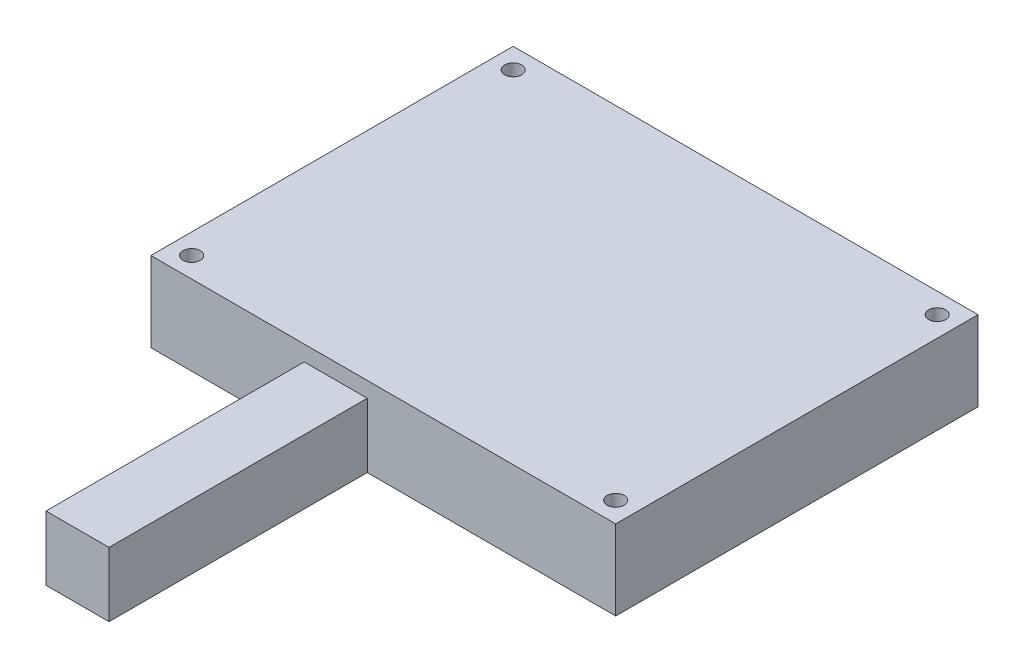
ISO-10303-21;
HEADER;
FILE_DESCRIPTION(('STEP AP214'),'2;1');
FILE_NAME('part.step','',(''),(''),'','','');
FILE_SCHEMA(('AUTOMOTIVE_DESIGN { 1 0 10303 214 1 1 1 1 }'));
ENDSEC;
DATA;
#1=APPLICATION_CONTEXT('core data for automotive mechanical design processes');
#2=APPLICATION_PROTOCOL_DEFINITION('international standard','automotive_design',2000,#1);
#3=PRODUCT_CONTEXT('',#1,'mechanical');
#4=PRODUCT('Part','Part','',(#3));
#5=PRODUCT_RELATED_PRODUCT_CATEGORY('part','',(#4));
#6=PRODUCT_DEFINITION_FORMATION('','',#4);
#7=PRODUCT_DEFINITION_CONTEXT('part definition',#1,'design');
#8=PRODUCT_DEFINITION('design','',#6,#7);
#9=PRODUCT_DEFINITION_SHAPE('','',#8);
#10=(LENGTH_UNIT() NAMED_UNIT(*) SI_UNIT(.MILLI.,.METRE.));
#11=(NAMED_UNIT(*) PLANE_ANGLE_UNIT() SI_UNIT($,.RADIAN.));
#12=(NAMED_UNIT(*) SI_UNIT($,.STERADIAN.) SOLID_ANGLE_UNIT());
#13=UNCERTAINTY_MEASURE_WITH_UNIT(LENGTH_MEASURE(1.E-05),#10,'distance_accuracy_value','');
#14=(GEOMETRIC_REPRESENTATION_CONTEXT(3) GLOBAL_UNCERTAINTY_ASSIGNED_CONTEXT((#13)) GLOBAL_UNIT_ASSIGNED_CONTEXT((#10,
#11,#12)) REPRESENTATION_CONTEXT('',''));
#15=CARTESIAN_POINT('',(0.,0.,0.));
#16=DIRECTION('',(0.,0.,1.));
#17=DIRECTION('',(1.,0.,0.));
#18=AXIS2_PLACEMENT_3D('',#15,#16,#17);
#19=CARTESIAN_POINT('',(-45.,15.45,35.075));
#20=DIRECTION('',(0.,0.,-1.));
#21=DIRECTION('',(-1.,0.,0.));
#22=AXIS2_PLACEMENT_3D('',#19,#20,#21);
#23=PLANE('',#22);
#24=DIRECTION('',(0.,-1.,0.));
#25=VECTOR('',#24,1.);
#26=CARTESIAN_POINT('',(-15.3,0.,35.075));
#27=LINE('',#26,#25);
#28=CARTESIAN_POINT('',(-15.3,12.46,35.075));
#29=VERTEX_POINT('',#28);
#30=CARTESIAN_POINT('',(-15.3,0.,35.075));
#31=VERTEX_POINT('',#30);
#32=EDGE_CURVE('E47',#29,#31,#27,.T.);
#33=ORIENTED_EDGE('',*,*,#32,.F.);
#34=DIRECTION('',(-1.,0.,0.));
#35=VECTOR('',#34,1.);
#36=CARTESIAN_POINT('',(-15.3,12.46,35.075));
#37=LINE('',#36,#35);
#38=CARTESIAN_POINT('',(-3.1,12.46,35.075));
#39=VERTEX_POINT('',#38);
#40=EDGE_CURVE('E118',#39,#29,#37,.T.);
#41=ORIENTED_EDGE('',*,*,#40,.F.);
#42=DIRECTION('',(0.,1.,0.));
#43=VECTOR('',#42,1.);
#44=CARTESIAN_POINT('',(-3.1,0.,35.075));
#45=LINE('',#44,#43);
#46=CARTESIAN_POINT('',(-3.10000000000001,0.,35.075));
#47=VERTEX_POINT('',#46);
#48=EDGE_CURVE('E53',#47,#39,#45,.T.);
#49=ORIENTED_EDGE('',*,*,#48,.F.);
#50=DIRECTION('',(1.,0.,0.));
#51=VECTOR('',#50,1.);
#52=CARTESIAN_POINT('',(-45.,0.,35.075));
#53=LINE('',#52,#51);
#54=CARTESIAN_POINT('',(45.,0.,35.075));
#55=VERTEX_POINT('',#54);
#56=EDGE_CURVE('E168',#47,#55,#53,.T.);
#57=ORIENTED_EDGE('',*,*,#56,.T.);
#58=DIRECTION('',(0.,-1.,0.));
#59=VECTOR('',#58,1.);
#60=CARTESIAN_POINT('',(45.,15.45,35.075));
#61=LINE('',#60,#59);
#62=CARTESIAN_POINT('',(45.,15.45,35.075));
#63=VERTEX_POINT('',#62);
#64=EDGE_CURVE('E161',#63,#55,#61,.T.);
#65=ORIENTED_EDGE('',*,*,#64,.F.);
#66=DIRECTION('',(1.,0.,0.));
#67=VECTOR('',#66,1.);
#68=CARTESIAN_POINT('',(-45.,15.45,35.075));
#69=LINE('',#68,#67);
#70=CARTESIAN_POINT('',(-45.,15.45,35.075));
#71=VERTEX_POINT('',#70);
#72=EDGE_CURVE('E159',#71,#63,#69,.T.);
#73=ORIENTED_EDGE('',*,*,#72,.F.);
#74=DIRECTION('',(0.,-1.,0.));
#75=VECTOR('',#74,1.);
#76=CARTESIAN_POINT('',(-45.,15.45,35.075));
#77=LINE('',#76,#75);
#78=CARTESIAN_POINT('',(-45.,0.,35.075));
#79=VERTEX_POINT('',#78);
#80=EDGE_CURVE('E172',#71,#79,#77,.T.);
#81=ORIENTED_EDGE('',*,*,#80,.T.);
#82=EDGE_CURVE('E155',#79,#31,#53,.T.);
#83=ORIENTED_EDGE('',*,*,#82,.T.);
#84=EDGE_LOOP('',(#33,#41,#49,#57,#65,#73,#81,#83));
#85=FACE_BOUND('',#84,.T.);
#86=ADVANCED_FACE('F32',(#85),#23,.F.);
#87=CARTESIAN_POINT('',(0.,15.45,0.));
#88=DIRECTION('',(0.,-1.,0.));
#89=DIRECTION('',(0.,0.,-1.));
#90=AXIS2_PLACEMENT_3D('',#87,#88,#89);
#91=PLANE('',#90);
#92=DIRECTION('',(0.,0.,-1.));
#93=VECTOR('',#92,1.);
#94=CARTESIAN_POINT('',(45.,15.45,35.075));
#95=LINE('',#94,#93);
#96=CARTESIAN_POINT('',(45.,15.45,-35.075));
#97=VERTEX_POINT('',#96);
#98=EDGE_CURVE('E151',#63,#97,#95,.T.);
#99=ORIENTED_EDGE('',*,*,#98,.T.);
#100=DIRECTION('',(-1.,0.,0.));
#101=VECTOR('',#100,1.);
#102=CARTESIAN_POINT('',(-45.,15.45,-35.075));
#103=LINE('',#102,#101);
#104=CARTESIAN_POINT('',(-45.,15.45,-35.075));
#105=VERTEX_POINT('',#104);
#106=EDGE_CURVE('E154',#97,#105,#103,.T.);
#107=ORIENTED_EDGE('',*,*,#106,.T.);
#108=DIRECTION('',(0.,0.,1.));
#109=VECTOR('',#108,1.);
#110=CARTESIAN_POINT('',(-45.,15.45,35.075));
#111=LINE('',#110,#109);
#112=EDGE_CURVE('E157',#105,#71,#111,.T.);
#113=ORIENTED_EDGE('',*,*,#112,.T.);
#114=ORIENTED_EDGE('',*,*,#72,.T.);
#115=EDGE_LOOP('',(#99,#107,#113,#114));
#116=FACE_BOUND('',#115,.T.);
#117=CARTESIAN_POINT('',(-41.05,15.45,-31.125));
#118=DIRECTION('',(0.,1.,0.));
#119=DIRECTION('',(0.,0.,1.));
#120=AXIS2_PLACEMENT_3D('',#117,#118,#119);
#121=CIRCLE('',#120,1.65);
#122=CARTESIAN_POINT('',(-41.05,15.45,-29.475));
#123=VERTEX_POINT('',#122);
#124=EDGE_CURVE('E145',#123,#123,#121,.T.);
#125=ORIENTED_EDGE('',*,*,#124,.F.);
#126=EDGE_LOOP('',(#125));
#127=FACE_BOUND('',#126,.T.);
#128=CARTESIAN_POINT('',(41.05,15.45,-31.125));
#129=DIRECTION('',(0.,1.,0.));
#130=DIRECTION('',(0.,0.,1.));
#131=AXIS2_PLACEMENT_3D('',#128,#129,#130);
#132=CIRCLE('',#131,1.65);
#133=CARTESIAN_POINT('',(41.05,15.45,-29.475));
#134=VERTEX_POINT('',#133);
#135=EDGE_CURVE('E139',#134,#134,#132,.T.);
#136=ORIENTED_EDGE('',*,*,#135,.F.);
#137=EDGE_LOOP('',(#136));
#138=FACE_BOUND('',#137,.T.);
#139=CARTESIAN_POINT('',(41.05,15.45,31.125));
#140=DIRECTION('',(0.,1.,0.));
#141=DIRECTION('',(0.,0.,1.));
#142=AXIS2_PLACEMENT_3D('',#139,#140,#141);
#143=CIRCLE('',#142,1.65);
#144=CARTESIAN_POINT('',(41.05,15.45,32.775));
#145=VERTEX_POINT('',#144);
#146=EDGE_CURVE('E133',#145,#145,#143,.T.);
#147=ORIENTED_EDGE('',*,*,#146,.F.);
#148=EDGE_LOOP('',(#147));
#149=FACE_BOUND('',#148,.T.);
#150=CARTESIAN_POINT('',(-41.05,15.45,31.125));
#151=DIRECTION('',(0.,1.,0.));
#152=DIRECTION('',(0.,0.,1.));
#153=AXIS2_PLACEMENT_3D('',#150,#151,#152);
#154=CIRCLE('',#153,1.65);
#155=CARTESIAN_POINT('',(-41.05,15.45,32.775));
#156=VERTEX_POINT('',#155);
#157=EDGE_CURVE('E124',#156,#156,#154,.T.);
#158=ORIENTED_EDGE('',*,*,#157,.F.);
#159=EDGE_LOOP('',(#158));
#160=FACE_BOUND('',#159,.T.);
#161=ADVANCED_FACE('F186',(#116,#127,#138,#149,#160),#91,.F.);
#162=CARTESIAN_POINT('',(0.,0.,0.));
#163=DIRECTION('',(0.,-1.,0.));
#164=DIRECTION('',(0.,0.,-1.));
#165=AXIS2_PLACEMENT_3D('',#162,#163,#164);
#166=PLANE('',#165);
#167=CARTESIAN_POINT('',(41.05,0.,31.125));
#168=DIRECTION('',(0.,1.,0.));
#169=DIRECTION('',(0.,0.,1.));
#170=AXIS2_PLACEMENT_3D('',#167,#168,#169);
#171=CIRCLE('',#170,1.65);
#172=CARTESIAN_POINT('',(41.05,0.,32.775));
#173=VERTEX_POINT('',#172);
#174=EDGE_CURVE('E131',#173,#173,#171,.T.);
#175=ORIENTED_EDGE('',*,*,#174,.T.);
#176=EDGE_LOOP('',(#175));
#177=FACE_BOUND('',#176,.T.);
#178=CARTESIAN_POINT('',(-41.05,0.,-31.125));
#179=DIRECTION('',(0.,1.,0.));
#180=DIRECTION('',(0.,0.,1.));
#181=AXIS2_PLACEMENT_3D('',#178,#179,#180);
#182=CIRCLE('',#181,1.65);
#183=CARTESIAN_POINT('',(-41.05,0.,-29.475));
#184=VERTEX_POINT('',#183);
#185=EDGE_CURVE('E142',#184,#184,#182,.T.);
#186=ORIENTED_EDGE('',*,*,#185,.T.);
#187=EDGE_LOOP('',(#186));
#188=FACE_BOUND('',#187,.T.);
#189=DIRECTION('',(0.,0.,-1.));
#190=VECTOR('',#189,1.);
#191=CARTESIAN_POINT('',(45.,0.,35.075));
#192=LINE('',#191,#190);
#193=CARTESIAN_POINT('',(45.,0.,-35.075));
#194=VERTEX_POINT('',#193);
#195=EDGE_CURVE('E148',#55,#194,#192,.T.);
#196=ORIENTED_EDGE('',*,*,#195,.F.);
#197=ORIENTED_EDGE('',*,*,#56,.F.);
#198=DIRECTION('',(0.,0.,-1.));
#199=VECTOR('',#198,1.);
#200=CARTESIAN_POINT('',(-3.1,0.,85.075));
#201=LINE('',#200,#199);
#202=CARTESIAN_POINT('',(-3.1,0.,85.075));
#203=VERTEX_POINT('',#202);
#204=EDGE_CURVE('E105',#203,#47,#201,.T.);
#205=ORIENTED_EDGE('',*,*,#204,.F.);
#206=DIRECTION('',(1.,0.,0.));
#207=VECTOR('',#206,1.);
#208=CARTESIAN_POINT('',(-15.3,0.,85.075));
#209=LINE('',#208,#207);
#210=CARTESIAN_POINT('',(-15.3,0.,85.075));
#211=VERTEX_POINT('',#210);
#212=EDGE_CURVE('E96',#211,#203,#209,.T.);
#213=ORIENTED_EDGE('',*,*,#212,.F.);
#214=DIRECTION('',(0.,0.,-1.));
#215=VECTOR('',#214,1.);
#216=CARTESIAN_POINT('',(-15.3,0.,85.075));
#217=LINE('',#216,#215);
#218=EDGE_CURVE('E103',#211,#31,#217,.T.);
#219=ORIENTED_EDGE('',*,*,#218,.T.);
#220=ORIENTED_EDGE('',*,*,#82,.F.);
#221=DIRECTION('',(0.,0.,1.));
#222=VECTOR('',#221,1.);
#223=CARTESIAN_POINT('',(-45.,0.,35.075));
#224=LINE('',#223,#222);
#225=CARTESIAN_POINT('',(-45.,0.,-35.075));
#226=VERTEX_POINT('',#225);
#227=EDGE_CURVE('E166',#226,#79,#224,.T.);
#228=ORIENTED_EDGE('',*,*,#227,.F.);
#229=DIRECTION('',(-1.,0.,0.));
#230=VECTOR('',#229,1.);
#231=CARTESIAN_POINT('',(-45.,0.,-35.075));
#232=LINE('',#231,#230);
#233=EDGE_CURVE('E164',#194,#226,#232,.T.);
#234=ORIENTED_EDGE('',*,*,#233,.F.);
#235=EDGE_LOOP('',(#196,#197,#205,#213,#219,#220,#228,#234));
#236=FACE_BOUND('',#235,.T.);
#237=CARTESIAN_POINT('',(41.05,0.,-31.125));
#238=DIRECTION('',(0.,1.,0.));
#239=DIRECTION('',(0.,0.,1.));
#240=AXIS2_PLACEMENT_3D('',#237,#238,#239);
#241=CIRCLE('',#240,1.65);
#242=CARTESIAN_POINT('',(41.05,0.,-29.475));
#243=VERTEX_POINT('',#242);
#244=EDGE_CURVE('E136',#243,#243,#241,.T.);
#245=ORIENTED_EDGE('',*,*,#244,.T.);
#246=EDGE_LOOP('',(#245));
#247=FACE_BOUND('',#246,.T.);
#248=CARTESIAN_POINT('',(-41.05,0.,31.125));
#249=DIRECTION('',(0.,1.,0.));
#250=DIRECTION('',(0.,0.,1.));
#251=AXIS2_PLACEMENT_3D('',#248,#249,#250);
#252=CIRCLE('',#251,1.65);
#253=CARTESIAN_POINT('',(-41.05,0.,32.775));
#254=VERTEX_POINT('',#253);
#255=EDGE_CURVE('E121',#254,#254,#252,.T.);
#256=ORIENTED_EDGE('',*,*,#255,.T.);
#257=EDGE_LOOP('',(#256));
#258=FACE_BOUND('',#257,.T.);
#259=ADVANCED_FACE('F99',(#177,#188,#236,#247,#258),#166,.T.);
#260=CARTESIAN_POINT('',(45.,15.45,35.075));
#261=DIRECTION('',(-1.,0.,0.));
#262=DIRECTION('',(0.,0.,1.));
#263=AXIS2_PLACEMENT_3D('',#260,#261,#262);
#264=PLANE('',#263);
#265=ORIENTED_EDGE('',*,*,#195,.T.);
#266=DIRECTION('',(0.,-1.,0.));
#267=VECTOR('',#266,1.);
#268=CARTESIAN_POINT('',(45.,15.45,-35.075));
#269=LINE('',#268,#267);
#270=EDGE_CURVE('E11',#97,#194,#269,.T.);
#271=ORIENTED_EDGE('',*,*,#270,.F.);
#272=ORIENTED_EDGE('',*,*,#98,.F.);
#273=ORIENTED_EDGE('',*,*,#64,.T.);
#274=EDGE_LOOP('',(#265,#271,#272,#273));
#275=FACE_BOUND('',#274,.T.);
#276=ADVANCED_FACE('F34',(#275),#264,.F.);
#277=CARTESIAN_POINT('',(-45.,15.45,-35.075));
#278=DIRECTION('',(0.,0.,1.));
#279=DIRECTION('',(1.,0.,0.));
#280=AXIS2_PLACEMENT_3D('',#277,#278,#279);
#281=PLANE('',#280);
#282=ORIENTED_EDGE('',*,*,#233,.T.);
#283=DIRECTION('',(0.,-1.,0.));
#284=VECTOR('',#283,1.);
#285=CARTESIAN_POINT('',(-45.,15.45,-35.075));
#286=LINE('',#285,#284);
#287=EDGE_CURVE('E40',#105,#226,#286,.T.);
#288=ORIENTED_EDGE('',*,*,#287,.F.);
#289=ORIENTED_EDGE('',*,*,#106,.F.);
#290=ORIENTED_EDGE('',*,*,#270,.T.);
#291=EDGE_LOOP('',(#282,#288,#289,#290));
#292=FACE_BOUND('',#291,.T.);
#293=ADVANCED_FACE('F189',(#292),#281,.F.);
#294=CARTESIAN_POINT('',(-45.,15.45,35.075));
#295=DIRECTION('',(1.,0.,0.));
#296=DIRECTION('',(0.,0.,-1.));
#297=AXIS2_PLACEMENT_3D('',#294,#295,#296);
#298=PLANE('',#297);
#299=ORIENTED_EDGE('',*,*,#227,.T.);
#300=ORIENTED_EDGE('',*,*,#80,.F.);
#301=ORIENTED_EDGE('',*,*,#112,.F.);
#302=ORIENTED_EDGE('',*,*,#287,.T.);
#303=EDGE_LOOP('',(#299,#300,#301,#302));
#304=FACE_BOUND('',#303,.T.);
#305=ADVANCED_FACE('F179',(#304),#298,.F.);
#306=CARTESIAN_POINT('',(-41.05,15.45,-31.125));
#307=DIRECTION('',(0.,-1.,0.));
#308=DIRECTION('',(0.,0.,-1.));
#309=AXIS2_PLACEMENT_3D('',#306,#307,#308);
#310=CYLINDRICAL_SURFACE('',#309,1.65);
#311=ORIENTED_EDGE('',*,*,#124,.T.);
#312=EDGE_LOOP('',(#311));
#313=FACE_BOUND('',#312,.T.);
#314=ORIENTED_EDGE('',*,*,#185,.F.);
#315=EDGE_LOOP('',(#314));
#316=FACE_BOUND('',#315,.T.);
#317=ADVANCED_FACE('F221',(#313,#316),#310,.F.);
#318=CARTESIAN_POINT('',(41.05,15.45,-31.125));
#319=DIRECTION('',(0.,-1.,0.));
#320=DIRECTION('',(0.,0.,-1.));
#321=AXIS2_PLACEMENT_3D('',#318,#319,#320);
#322=CYLINDRICAL_SURFACE('',#321,1.65);
#323=ORIENTED_EDGE('',*,*,#135,.T.);
#324=EDGE_LOOP('',(#323));
#325=FACE_BOUND('',#324,.T.);
#326=ORIENTED_EDGE('',*,*,#244,.F.);
#327=EDGE_LOOP('',(#326));
#328=FACE_BOUND('',#327,.T.);
#329=ADVANCED_FACE('F237',(#325,#328),#322,.F.);
#330=CARTESIAN_POINT('',(41.05,15.45,31.125));
#331=DIRECTION('',(0.,-1.,0.));
#332=DIRECTION('',(0.,0.,-1.));
#333=AXIS2_PLACEMENT_3D('',#330,#331,#332);
#334=CYLINDRICAL_SURFACE('',#333,1.65);
#335=ORIENTED_EDGE('',*,*,#146,.T.);
#336=EDGE_LOOP('',(#335));
#337=FACE_BOUND('',#336,.T.);
#338=ORIENTED_EDGE('',*,*,#174,.F.);
#339=EDGE_LOOP('',(#338));
#340=FACE_BOUND('',#339,.T.);
#341=ADVANCED_FACE('F243',(#337,#340),#334,.F.);
#342=CARTESIAN_POINT('',(-41.05,15.45,31.125));
#343=DIRECTION('',(0.,-1.,0.));
#344=DIRECTION('',(0.,0.,-1.));
#345=AXIS2_PLACEMENT_3D('',#342,#343,#344);
#346=CYLINDRICAL_SURFACE('',#345,1.65);
#347=ORIENTED_EDGE('',*,*,#157,.T.);
#348=EDGE_LOOP('',(#347));
#349=FACE_BOUND('',#348,.T.);
#350=ORIENTED_EDGE('',*,*,#255,.F.);
#351=EDGE_LOOP('',(#350));
#352=FACE_BOUND('',#351,.T.);
#353=ADVANCED_FACE('F249',(#349,#352),#346,.F.);
#354=CARTESIAN_POINT('',(-15.3,0.,85.075));
#355=DIRECTION('',(1.,0.,0.));
#356=DIRECTION('',(0.,0.,-1.));
#357=AXIS2_PLACEMENT_3D('',#354,#355,#356);
#358=PLANE('',#357);
#359=ORIENTED_EDGE('',*,*,#32,.T.);
#360=ORIENTED_EDGE('',*,*,#218,.F.);
#361=DIRECTION('',(0.,-1.,0.));
#362=VECTOR('',#361,1.);
#363=CARTESIAN_POINT('',(-15.3,0.,85.075));
#364=LINE('',#363,#362);
#365=CARTESIAN_POINT('',(-15.3,12.46,85.075));
#366=VERTEX_POINT('',#365);
#367=EDGE_CURVE('E109',#366,#211,#364,.T.);
#368=ORIENTED_EDGE('',*,*,#367,.F.);
#369=DIRECTION('',(0.,0.,-1.));
#370=VECTOR('',#369,1.);
#371=CARTESIAN_POINT('',(-15.3,12.46,85.075));
#372=LINE('',#371,#370);
#373=EDGE_CURVE('E196',#366,#29,#372,.T.);
#374=ORIENTED_EDGE('',*,*,#373,.T.);
#375=EDGE_LOOP('',(#359,#360,#368,#374));
#376=FACE_BOUND('',#375,.T.);
#377=ADVANCED_FACE('F120',(#376),#358,.F.);
#378=CARTESIAN_POINT('',(-3.1,0.,85.075));
#379=DIRECTION('',(-1.,0.,0.));
#380=DIRECTION('',(0.,0.,1.));
#381=AXIS2_PLACEMENT_3D('',#378,#379,#380);
#382=PLANE('',#381);
#383=ORIENTED_EDGE('',*,*,#48,.T.);
#384=DIRECTION('',(0.,0.,-1.));
#385=VECTOR('',#384,1.);
#386=CARTESIAN_POINT('',(-3.1,12.46,85.075));
#387=LINE('',#386,#385);
#388=CARTESIAN_POINT('',(-3.1,12.46,85.075));
#389=VERTEX_POINT('',#388);
#390=EDGE_CURVE('E126',#389,#39,#387,.T.);
#391=ORIENTED_EDGE('',*,*,#390,.F.);
#392=DIRECTION('',(0.,1.,0.));
#393=VECTOR('',#392,1.);
#394=CARTESIAN_POINT('',(-3.1,0.,85.075));
#395=LINE('',#394,#393);
#396=EDGE_CURVE('E108',#203,#389,#395,.T.);
#397=ORIENTED_EDGE('',*,*,#396,.F.);
#398=ORIENTED_EDGE('',*,*,#204,.T.);
#399=EDGE_LOOP('',(#383,#391,#397,#398));
#400=FACE_BOUND('',#399,.T.);
#401=ADVANCED_FACE('F192',(#400),#382,.F.);
#402=CARTESIAN_POINT('',(-15.3,12.46,85.075));
#403=DIRECTION('',(0.,-1.,0.));
#404=DIRECTION('',(0.,0.,-1.));
#405=AXIS2_PLACEMENT_3D('',#402,#403,#404);
#406=PLANE('',#405);
#407=ORIENTED_EDGE('',*,*,#40,.T.);
#408=ORIENTED_EDGE('',*,*,#373,.F.);
#409=DIRECTION('',(-1.,0.,0.));
#410=VECTOR('',#409,1.);
#411=CARTESIAN_POINT('',(-15.3,12.46,85.075));
#412=LINE('',#411,#410);
#413=EDGE_CURVE('E114',#389,#366,#412,.T.);
#414=ORIENTED_EDGE('',*,*,#413,.F.);
#415=ORIENTED_EDGE('',*,*,#390,.T.);
#416=EDGE_LOOP('',(#407,#408,#414,#415));
#417=FACE_BOUND('',#416,.T.);
#418=ADVANCED_FACE('F203',(#417),#406,.F.);
#419=CARTESIAN_POINT('',(0.,0.,85.075));
#420=DIRECTION('',(0.,0.,-1.));
#421=DIRECTION('',(-1.,0.,0.));
#422=AXIS2_PLACEMENT_3D('',#419,#420,#421);
#423=PLANE('',#422);
#424=ORIENTED_EDGE('',*,*,#367,.T.);
#425=ORIENTED_EDGE('',*,*,#212,.T.);
#426=ORIENTED_EDGE('',*,*,#396,.T.);
#427=ORIENTED_EDGE('',*,*,#413,.T.);
#428=EDGE_LOOP('',(#424,#425,#426,#427));
#429=FACE_BOUND('',#428,.T.);
#430=ADVANCED_FACE('F112',(#429),#423,.F.);
#431=CLOSED_SHELL('',(#86,#161,#259,#276,#293,#305,#317,#329,#341,#353,#377,#401,#418,#430));
#432=MANIFOLD_SOLID_BREP('B2',#431);
#433=ADVANCED_BREP_SHAPE_REPRESENTATION('',(#18,#432),#14);
#434=SHAPE_DEFINITION_REPRESENTATION(#9,#433);
ENDSEC;
END-ISO-10303-21;
